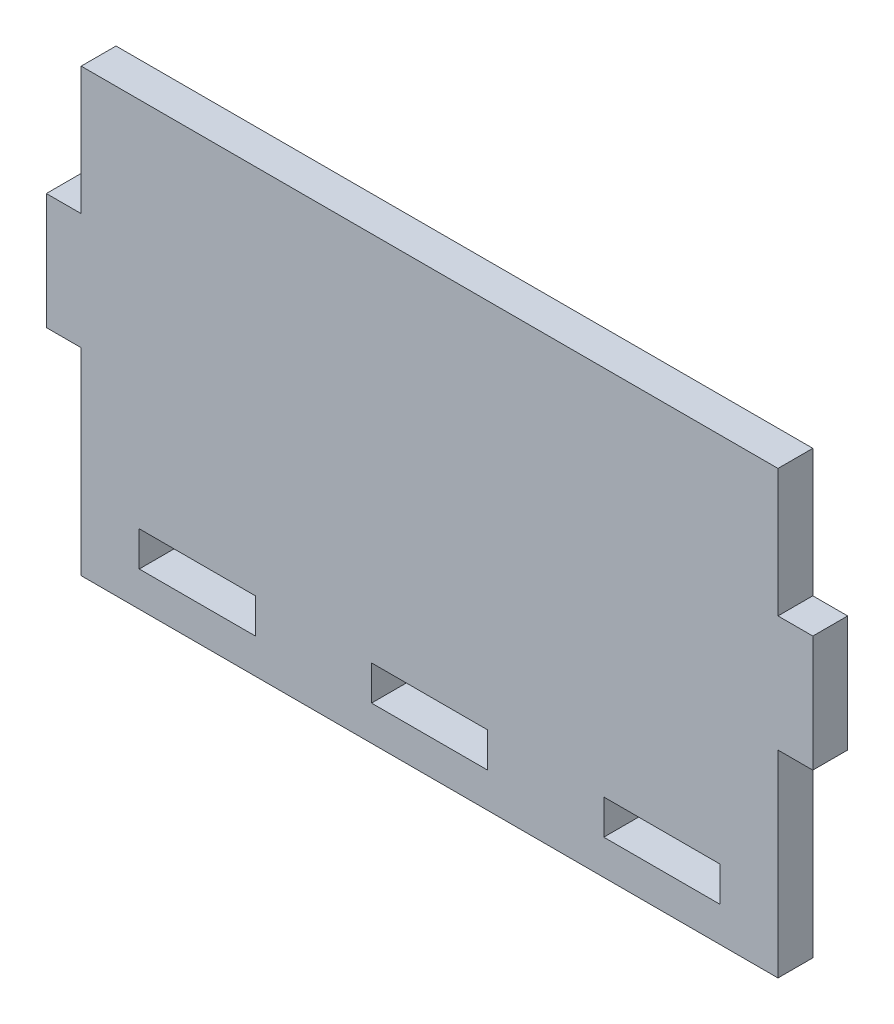
ISO-10303-21;
HEADER;
FILE_DESCRIPTION(('STEP AP214'),'2;1');
FILE_NAME('part.step','',(''),(''),'','','');
FILE_SCHEMA(('AUTOMOTIVE_DESIGN { 1 0 10303 214 1 1 1 1 }'));
ENDSEC;
DATA;
#1=APPLICATION_CONTEXT('core data for automotive mechanical design processes');
#2=APPLICATION_PROTOCOL_DEFINITION('international standard','automotive_design',2000,#1);
#3=PRODUCT_CONTEXT('',#1,'mechanical');
#4=PRODUCT('Part','Part','',(#3));
#5=PRODUCT_RELATED_PRODUCT_CATEGORY('part','',(#4));
#6=PRODUCT_DEFINITION_FORMATION('','',#4);
#7=PRODUCT_DEFINITION_CONTEXT('part definition',#1,'design');
#8=PRODUCT_DEFINITION('design','',#6,#7);
#9=PRODUCT_DEFINITION_SHAPE('','',#8);
#10=(LENGTH_UNIT() NAMED_UNIT(*) SI_UNIT(.MILLI.,.METRE.));
#11=(NAMED_UNIT(*) PLANE_ANGLE_UNIT() SI_UNIT($,.RADIAN.));
#12=(NAMED_UNIT(*) SI_UNIT($,.STERADIAN.) SOLID_ANGLE_UNIT());
#13=UNCERTAINTY_MEASURE_WITH_UNIT(LENGTH_MEASURE(1.E-05),#10,'distance_accuracy_value','');
#14=(GEOMETRIC_REPRESENTATION_CONTEXT(3) GLOBAL_UNCERTAINTY_ASSIGNED_CONTEXT((#13)) GLOBAL_UNIT_ASSIGNED_CONTEXT((#10,
#11,#12)) REPRESENTATION_CONTEXT('',''));
#15=CARTESIAN_POINT('',(0.,0.,0.));
#16=DIRECTION('',(0.,0.,1.));
#17=DIRECTION('',(1.,0.,0.));
#18=AXIS2_PLACEMENT_3D('',#15,#16,#17);
#19=CARTESIAN_POINT('',(12.1493212669683,0.,3.));
#20=DIRECTION('',(1.,0.,0.));
#21=DIRECTION('',(0.,0.,-1.));
#22=AXIS2_PLACEMENT_3D('',#19,#20,#21);
#23=PLANE('',#22);
#24=DIRECTION('',(0.,-1.,0.));
#25=VECTOR('',#24,1.);
#26=CARTESIAN_POINT('',(12.1493212669683,0.,0.));
#27=LINE('',#26,#25);
#28=CARTESIAN_POINT('',(12.1493212669683,-16.9321266968326,0.));
#29=VERTEX_POINT('',#28);
#30=CARTESIAN_POINT('',(12.1493212669683,-19.9321266968326,0.));
#31=VERTEX_POINT('',#30);
#32=EDGE_CURVE('E284',#29,#31,#27,.T.);
#33=ORIENTED_EDGE('',*,*,#32,.F.);
#34=DIRECTION('',(0.,0.,-1.));
#35=VECTOR('',#34,1.);
#36=CARTESIAN_POINT('',(12.1493212669683,-16.9321266968326,3.));
#37=LINE('',#36,#35);
#38=CARTESIAN_POINT('',(12.1493212669683,-16.9321266968326,3.));
#39=VERTEX_POINT('',#38);
#40=EDGE_CURVE('E11',#39,#29,#37,.T.);
#41=ORIENTED_EDGE('',*,*,#40,.F.);
#42=DIRECTION('',(0.,-1.,0.));
#43=VECTOR('',#42,1.);
#44=CARTESIAN_POINT('',(12.1493212669683,0.,3.));
#45=LINE('',#44,#43);
#46=CARTESIAN_POINT('',(12.1493212669683,-19.9321266968326,3.));
#47=VERTEX_POINT('',#46);
#48=EDGE_CURVE('E221',#39,#47,#45,.T.);
#49=ORIENTED_EDGE('',*,*,#48,.T.);
#50=DIRECTION('',(0.,0.,-1.));
#51=VECTOR('',#50,1.);
#52=CARTESIAN_POINT('',(12.1493212669683,-19.9321266968326,3.));
#53=LINE('',#52,#51);
#54=EDGE_CURVE('E134',#47,#31,#53,.T.);
#55=ORIENTED_EDGE('',*,*,#54,.T.);
#56=EDGE_LOOP('',(#33,#41,#49,#55));
#57=FACE_BOUND('',#56,.T.);
#58=ADVANCED_FACE('F32',(#57),#23,.T.);
#59=CARTESIAN_POINT('',(0.,-16.9321266968326,3.));
#60=DIRECTION('',(0.,-1.,0.));
#61=DIRECTION('',(0.,0.,-1.));
#62=AXIS2_PLACEMENT_3D('',#59,#60,#61);
#63=PLANE('',#62);
#64=DIRECTION('',(-1.,0.,0.));
#65=VECTOR('',#64,1.);
#66=CARTESIAN_POINT('',(0.,-16.9321266968326,0.));
#67=LINE('',#66,#65);
#68=CARTESIAN_POINT('',(22.1493212669683,-16.9321266968326,0.));
#69=VERTEX_POINT('',#68);
#70=EDGE_CURVE('E211',#69,#29,#67,.T.);
#71=ORIENTED_EDGE('',*,*,#70,.F.);
#72=DIRECTION('',(0.,0.,-1.));
#73=VECTOR('',#72,1.);
#74=CARTESIAN_POINT('',(22.1493212669683,-16.9321266968326,3.));
#75=LINE('',#74,#73);
#76=CARTESIAN_POINT('',(22.1493212669683,-16.9321266968326,3.));
#77=VERTEX_POINT('',#76);
#78=EDGE_CURVE('E42',#77,#69,#75,.T.);
#79=ORIENTED_EDGE('',*,*,#78,.F.);
#80=DIRECTION('',(-1.,0.,0.));
#81=VECTOR('',#80,1.);
#82=CARTESIAN_POINT('',(0.,-16.9321266968326,3.));
#83=LINE('',#82,#81);
#84=EDGE_CURVE('E209',#77,#39,#83,.T.);
#85=ORIENTED_EDGE('',*,*,#84,.T.);
#86=ORIENTED_EDGE('',*,*,#40,.T.);
#87=EDGE_LOOP('',(#71,#79,#85,#86));
#88=FACE_BOUND('',#87,.T.);
#89=ADVANCED_FACE('F207',(#88),#63,.T.);
#90=CARTESIAN_POINT('',(22.1493212669683,0.,3.));
#91=DIRECTION('',(1.,0.,0.));
#92=DIRECTION('',(0.,1.,0.));
#93=AXIS2_PLACEMENT_3D('',#90,#91,#92);
#94=PLANE('',#93);
#95=DIRECTION('',(0.,-1.,0.));
#96=VECTOR('',#95,1.);
#97=CARTESIAN_POINT('',(22.1493212669683,0.,0.));
#98=LINE('',#97,#96);
#99=CARTESIAN_POINT('',(22.1493212669683,-19.9321266968326,0.));
#100=VERTEX_POINT('',#99);
#101=EDGE_CURVE('E287',#69,#100,#98,.T.);
#102=ORIENTED_EDGE('',*,*,#101,.T.);
#103=DIRECTION('',(0.,0.,-1.));
#104=VECTOR('',#103,1.);
#105=CARTESIAN_POINT('',(22.1493212669683,-19.9321266968326,3.));
#106=LINE('',#105,#104);
#107=CARTESIAN_POINT('',(22.1493212669683,-19.9321266968326,3.));
#108=VERTEX_POINT('',#107);
#109=EDGE_CURVE('E214',#108,#100,#106,.T.);
#110=ORIENTED_EDGE('',*,*,#109,.F.);
#111=DIRECTION('',(0.,-1.,0.));
#112=VECTOR('',#111,1.);
#113=CARTESIAN_POINT('',(22.1493212669683,0.,3.));
#114=LINE('',#113,#112);
#115=EDGE_CURVE('E217',#77,#108,#114,.T.);
#116=ORIENTED_EDGE('',*,*,#115,.F.);
#117=ORIENTED_EDGE('',*,*,#78,.T.);
#118=EDGE_LOOP('',(#102,#110,#116,#117));
#119=FACE_BOUND('',#118,.T.);
#120=ADVANCED_FACE('F218',(#119),#94,.F.);
#121=CARTESIAN_POINT('',(-27.8506787330317,0.,3.));
#122=DIRECTION('',(1.,0.,0.));
#123=DIRECTION('',(0.,1.,0.));
#124=AXIS2_PLACEMENT_3D('',#121,#122,#123);
#125=PLANE('',#124);
#126=DIRECTION('',(0.,-1.,0.));
#127=VECTOR('',#126,1.);
#128=CARTESIAN_POINT('',(-27.8506787330317,0.,0.));
#129=LINE('',#128,#127);
#130=CARTESIAN_POINT('',(-27.8506787330317,-16.9321266968326,0.));
#131=VERTEX_POINT('',#130);
#132=CARTESIAN_POINT('',(-27.8506787330317,-19.9321266968326,0.));
#133=VERTEX_POINT('',#132);
#134=EDGE_CURVE('E272',#131,#133,#129,.T.);
#135=ORIENTED_EDGE('',*,*,#134,.F.);
#136=DIRECTION('',(0.,0.,-1.));
#137=VECTOR('',#136,1.);
#138=CARTESIAN_POINT('',(-27.8506787330317,-16.9321266968326,3.));
#139=LINE('',#138,#137);
#140=CARTESIAN_POINT('',(-27.8506787330317,-16.9321266968326,3.));
#141=VERTEX_POINT('',#140);
#142=EDGE_CURVE('E292',#141,#131,#139,.T.);
#143=ORIENTED_EDGE('',*,*,#142,.F.);
#144=DIRECTION('',(0.,-1.,0.));
#145=VECTOR('',#144,1.);
#146=CARTESIAN_POINT('',(-27.8506787330317,0.,3.));
#147=LINE('',#146,#145);
#148=CARTESIAN_POINT('',(-27.8506787330317,-19.9321266968326,3.));
#149=VERTEX_POINT('',#148);
#150=EDGE_CURVE('E669',#141,#149,#147,.T.);
#151=ORIENTED_EDGE('',*,*,#150,.T.);
#152=DIRECTION('',(0.,0.,-1.));
#153=VECTOR('',#152,1.);
#154=CARTESIAN_POINT('',(-27.8506787330317,-19.9321266968326,3.));
#155=LINE('',#154,#153);
#156=EDGE_CURVE('E294',#149,#133,#155,.T.);
#157=ORIENTED_EDGE('',*,*,#156,.T.);
#158=EDGE_LOOP('',(#135,#143,#151,#157));
#159=FACE_BOUND('',#158,.T.);
#160=ADVANCED_FACE('F381',(#159),#125,.T.);
#161=CARTESIAN_POINT('',(0.,-16.9321266968326,3.));
#162=DIRECTION('',(0.,1.,0.));
#163=DIRECTION('',(0.,0.,1.));
#164=AXIS2_PLACEMENT_3D('',#161,#162,#163);
#165=PLANE('',#164);
#166=DIRECTION('',(1.,0.,0.));
#167=VECTOR('',#166,1.);
#168=CARTESIAN_POINT('',(0.,-16.9321266968326,0.));
#169=LINE('',#168,#167);
#170=CARTESIAN_POINT('',(-17.8506787330317,-16.9321266968326,0.));
#171=VERTEX_POINT('',#170);
#172=EDGE_CURVE('E275',#131,#171,#169,.T.);
#173=ORIENTED_EDGE('',*,*,#172,.T.);
#174=DIRECTION('',(0.,0.,-1.));
#175=VECTOR('',#174,1.);
#176=CARTESIAN_POINT('',(-17.8506787330317,-16.9321266968326,3.));
#177=LINE('',#176,#175);
#178=CARTESIAN_POINT('',(-17.8506787330317,-16.9321266968326,3.));
#179=VERTEX_POINT('',#178);
#180=EDGE_CURVE('E299',#179,#171,#177,.T.);
#181=ORIENTED_EDGE('',*,*,#180,.F.);
#182=DIRECTION('',(1.,0.,0.));
#183=VECTOR('',#182,1.);
#184=CARTESIAN_POINT('',(0.,-16.9321266968326,3.));
#185=LINE('',#184,#183);
#186=EDGE_CURVE('E672',#141,#179,#185,.T.);
#187=ORIENTED_EDGE('',*,*,#186,.F.);
#188=ORIENTED_EDGE('',*,*,#142,.T.);
#189=EDGE_LOOP('',(#173,#181,#187,#188));
#190=FACE_BOUND('',#189,.T.);
#191=ADVANCED_FACE('F377',(#190),#165,.F.);
#192=CARTESIAN_POINT('',(-17.8506787330317,0.,3.));
#193=DIRECTION('',(1.,0.,0.));
#194=DIRECTION('',(0.,0.,-1.));
#195=AXIS2_PLACEMENT_3D('',#192,#193,#194);
#196=PLANE('',#195);
#197=DIRECTION('',(0.,-1.,0.));
#198=VECTOR('',#197,1.);
#199=CARTESIAN_POINT('',(-17.8506787330317,0.,0.));
#200=LINE('',#199,#198);
#201=CARTESIAN_POINT('',(-17.8506787330317,-19.9321266968326,0.));
#202=VERTEX_POINT('',#201);
#203=EDGE_CURVE('E278',#171,#202,#200,.T.);
#204=ORIENTED_EDGE('',*,*,#203,.T.);
#205=DIRECTION('',(0.,0.,-1.));
#206=VECTOR('',#205,1.);
#207=CARTESIAN_POINT('',(-17.8506787330317,-19.9321266968326,3.));
#208=LINE('',#207,#206);
#209=CARTESIAN_POINT('',(-17.8506787330317,-19.9321266968326,3.));
#210=VERTEX_POINT('',#209);
#211=EDGE_CURVE('E296',#210,#202,#208,.T.);
#212=ORIENTED_EDGE('',*,*,#211,.F.);
#213=DIRECTION('',(0.,-1.,0.));
#214=VECTOR('',#213,1.);
#215=CARTESIAN_POINT('',(-17.8506787330317,0.,3.));
#216=LINE('',#215,#214);
#217=EDGE_CURVE('E675',#179,#210,#216,.T.);
#218=ORIENTED_EDGE('',*,*,#217,.F.);
#219=ORIENTED_EDGE('',*,*,#180,.T.);
#220=EDGE_LOOP('',(#204,#212,#218,#219));
#221=FACE_BOUND('',#220,.T.);
#222=ADVANCED_FACE('F373',(#221),#196,.F.);
#223=CARTESIAN_POINT('',(27.1493212669683,0.,3.));
#224=DIRECTION('',(1.,0.,0.));
#225=DIRECTION('',(0.,0.,-1.));
#226=AXIS2_PLACEMENT_3D('',#223,#224,#225);
#227=PLANE('',#226);
#228=DIRECTION('',(0.,-1.,0.));
#229=VECTOR('',#228,1.);
#230=CARTESIAN_POINT('',(27.1493212669683,0.,0.));
#231=LINE('',#230,#229);
#232=CARTESIAN_POINT('',(27.1493212669683,15.0678733031674,0.));
#233=VERTEX_POINT('',#232);
#234=CARTESIAN_POINT('',(27.1493212669683,4.06787330316742,0.));
#235=VERTEX_POINT('',#234);
#236=EDGE_CURVE('E240',#233,#235,#231,.T.);
#237=ORIENTED_EDGE('',*,*,#236,.F.);
#238=DIRECTION('',(0.,0.,-1.));
#239=VECTOR('',#238,1.);
#240=CARTESIAN_POINT('',(27.1493212669683,15.0678733031674,3.));
#241=LINE('',#240,#239);
#242=CARTESIAN_POINT('',(27.1493212669683,15.0678733031674,3.));
#243=VERTEX_POINT('',#242);
#244=EDGE_CURVE('E297',#243,#233,#241,.T.);
#245=ORIENTED_EDGE('',*,*,#244,.F.);
#246=DIRECTION('',(0.,-1.,0.));
#247=VECTOR('',#246,1.);
#248=CARTESIAN_POINT('',(27.1493212669683,0.,3.));
#249=LINE('',#248,#247);
#250=CARTESIAN_POINT('',(27.1493212669683,4.06787330316742,3.));
#251=VERTEX_POINT('',#250);
#252=EDGE_CURVE('E658',#243,#251,#249,.T.);
#253=ORIENTED_EDGE('',*,*,#252,.T.);
#254=DIRECTION('',(0.,0.,-1.));
#255=VECTOR('',#254,1.);
#256=CARTESIAN_POINT('',(27.1493212669683,4.06787330316742,3.));
#257=LINE('',#256,#255);
#258=EDGE_CURVE('E303',#251,#235,#257,.T.);
#259=ORIENTED_EDGE('',*,*,#258,.T.);
#260=EDGE_LOOP('',(#237,#245,#253,#259));
#261=FACE_BOUND('',#260,.T.);
#262=ADVANCED_FACE('F376',(#261),#227,.T.);
#263=CARTESIAN_POINT('',(0.,15.0678733031674,3.));
#264=DIRECTION('',(0.,1.,0.));
#265=DIRECTION('',(0.,0.,1.));
#266=AXIS2_PLACEMENT_3D('',#263,#264,#265);
#267=PLANE('',#266);
#268=DIRECTION('',(1.,0.,0.));
#269=VECTOR('',#268,1.);
#270=CARTESIAN_POINT('',(0.,15.0678733031674,0.));
#271=LINE('',#270,#269);
#272=CARTESIAN_POINT('',(-32.8506787330317,15.0678733031674,0.));
#273=VERTEX_POINT('',#272);
#274=EDGE_CURVE('E243',#273,#233,#271,.T.);
#275=ORIENTED_EDGE('',*,*,#274,.F.);
#276=DIRECTION('',(0.,0.,-1.));
#277=VECTOR('',#276,1.);
#278=CARTESIAN_POINT('',(-32.8506787330317,15.0678733031674,3.));
#279=LINE('',#278,#277);
#280=CARTESIAN_POINT('',(-32.8506787330317,15.0678733031674,3.));
#281=VERTEX_POINT('',#280);
#282=EDGE_CURVE('E328',#281,#273,#279,.T.);
#283=ORIENTED_EDGE('',*,*,#282,.F.);
#284=DIRECTION('',(1.,0.,0.));
#285=VECTOR('',#284,1.);
#286=CARTESIAN_POINT('',(0.,15.0678733031674,3.));
#287=LINE('',#286,#285);
#288=EDGE_CURVE('E619',#281,#243,#287,.T.);
#289=ORIENTED_EDGE('',*,*,#288,.T.);
#290=ORIENTED_EDGE('',*,*,#244,.T.);
#291=EDGE_LOOP('',(#275,#283,#289,#290));
#292=FACE_BOUND('',#291,.T.);
#293=ADVANCED_FACE('F422',(#292),#267,.T.);
#294=CARTESIAN_POINT('',(-32.8506787330317,0.,3.));
#295=DIRECTION('',(1.,0.,0.));
#296=DIRECTION('',(0.,1.,0.));
#297=AXIS2_PLACEMENT_3D('',#294,#295,#296);
#298=PLANE('',#297);
#299=DIRECTION('',(0.,-1.,0.));
#300=VECTOR('',#299,1.);
#301=CARTESIAN_POINT('',(-32.8506787330317,0.,0.));
#302=LINE('',#301,#300);
#303=CARTESIAN_POINT('',(-32.8506787330317,4.06787330316742,0.));
#304=VERTEX_POINT('',#303);
#305=EDGE_CURVE('E247',#273,#304,#302,.T.);
#306=ORIENTED_EDGE('',*,*,#305,.T.);
#307=DIRECTION('',(0.,0.,-1.));
#308=VECTOR('',#307,1.);
#309=CARTESIAN_POINT('',(-32.8506787330317,4.06787330316742,3.));
#310=LINE('',#309,#308);
#311=CARTESIAN_POINT('',(-32.8506787330317,4.06787330316742,3.));
#312=VERTEX_POINT('',#311);
#313=EDGE_CURVE('E325',#312,#304,#310,.T.);
#314=ORIENTED_EDGE('',*,*,#313,.F.);
#315=DIRECTION('',(0.,-1.,0.));
#316=VECTOR('',#315,1.);
#317=CARTESIAN_POINT('',(-32.8506787330317,0.,3.));
#318=LINE('',#317,#316);
#319=EDGE_CURVE('E654',#281,#312,#318,.T.);
#320=ORIENTED_EDGE('',*,*,#319,.F.);
#321=ORIENTED_EDGE('',*,*,#282,.T.);
#322=EDGE_LOOP('',(#306,#314,#320,#321));
#323=FACE_BOUND('',#322,.T.);
#324=ADVANCED_FACE('F410',(#323),#298,.F.);
#325=CARTESIAN_POINT('',(0.,4.06787330316742,3.));
#326=DIRECTION('',(0.,-1.,0.));
#327=DIRECTION('',(0.,0.,-1.));
#328=AXIS2_PLACEMENT_3D('',#325,#326,#327);
#329=PLANE('',#328);
#330=DIRECTION('',(-1.,0.,0.));
#331=VECTOR('',#330,1.);
#332=CARTESIAN_POINT('',(0.,4.06787330316742,0.));
#333=LINE('',#332,#331);
#334=CARTESIAN_POINT('',(-35.8506787330317,4.06787330316742,0.));
#335=VERTEX_POINT('',#334);
#336=EDGE_CURVE('E250',#304,#335,#333,.T.);
#337=ORIENTED_EDGE('',*,*,#336,.T.);
#338=DIRECTION('',(0.,0.,-1.));
#339=VECTOR('',#338,1.);
#340=CARTESIAN_POINT('',(-35.8506787330317,4.06787330316742,3.));
#341=LINE('',#340,#339);
#342=CARTESIAN_POINT('',(-35.8506787330317,4.06787330316742,3.));
#343=VERTEX_POINT('',#342);
#344=EDGE_CURVE('E322',#343,#335,#341,.T.);
#345=ORIENTED_EDGE('',*,*,#344,.F.);
#346=DIRECTION('',(-1.,0.,0.));
#347=VECTOR('',#346,1.);
#348=CARTESIAN_POINT('',(0.,4.06787330316742,3.));
#349=LINE('',#348,#347);
#350=EDGE_CURVE('E651',#312,#343,#349,.T.);
#351=ORIENTED_EDGE('',*,*,#350,.F.);
#352=ORIENTED_EDGE('',*,*,#313,.T.);
#353=EDGE_LOOP('',(#337,#345,#351,#352));
#354=FACE_BOUND('',#353,.T.);
#355=ADVANCED_FACE('F417',(#354),#329,.F.);
#356=CARTESIAN_POINT('',(-35.8506787330317,0.,3.));
#357=DIRECTION('',(1.,0.,0.));
#358=DIRECTION('',(0.,0.,-1.));
#359=AXIS2_PLACEMENT_3D('',#356,#357,#358);
#360=PLANE('',#359);
#361=DIRECTION('',(0.,-1.,0.));
#362=VECTOR('',#361,1.);
#363=CARTESIAN_POINT('',(-35.8506787330317,0.,0.));
#364=LINE('',#363,#362);
#365=CARTESIAN_POINT('',(-35.8506787330317,-5.93212669683258,0.));
#366=VERTEX_POINT('',#365);
#367=EDGE_CURVE('E254',#335,#366,#364,.T.);
#368=ORIENTED_EDGE('',*,*,#367,.T.);
#369=DIRECTION('',(0.,0.,-1.));
#370=VECTOR('',#369,1.);
#371=CARTESIAN_POINT('',(-35.8506787330317,-5.93212669683258,3.));
#372=LINE('',#371,#370);
#373=CARTESIAN_POINT('',(-35.8506787330317,-5.93212669683258,3.));
#374=VERTEX_POINT('',#373);
#375=EDGE_CURVE('E319',#374,#366,#372,.T.);
#376=ORIENTED_EDGE('',*,*,#375,.F.);
#377=DIRECTION('',(0.,-1.,0.));
#378=VECTOR('',#377,1.);
#379=CARTESIAN_POINT('',(-35.8506787330317,0.,3.));
#380=LINE('',#379,#378);
#381=EDGE_CURVE('E649',#343,#374,#380,.T.);
#382=ORIENTED_EDGE('',*,*,#381,.F.);
#383=ORIENTED_EDGE('',*,*,#344,.T.);
#384=EDGE_LOOP('',(#368,#376,#382,#383));
#385=FACE_BOUND('',#384,.T.);
#386=ADVANCED_FACE('F413',(#385),#360,.F.);
#387=CARTESIAN_POINT('',(0.,-5.93212669683258,3.));
#388=DIRECTION('',(0.,1.,0.));
#389=DIRECTION('',(0.,0.,1.));
#390=AXIS2_PLACEMENT_3D('',#387,#388,#389);
#391=PLANE('',#390);
#392=DIRECTION('',(1.,0.,0.));
#393=VECTOR('',#392,1.);
#394=CARTESIAN_POINT('',(0.,-5.93212669683258,0.));
#395=LINE('',#394,#393);
#396=CARTESIAN_POINT('',(-32.8506787330317,-5.93212669683258,0.));
#397=VERTEX_POINT('',#396);
#398=EDGE_CURVE('E257',#366,#397,#395,.T.);
#399=ORIENTED_EDGE('',*,*,#398,.T.);
#400=DIRECTION('',(0.,0.,-1.));
#401=VECTOR('',#400,1.);
#402=CARTESIAN_POINT('',(-32.8506787330317,-5.93212669683258,3.));
#403=LINE('',#402,#401);
#404=CARTESIAN_POINT('',(-32.8506787330317,-5.93212669683258,3.));
#405=VERTEX_POINT('',#404);
#406=EDGE_CURVE('E316',#405,#397,#403,.T.);
#407=ORIENTED_EDGE('',*,*,#406,.F.);
#408=DIRECTION('',(1.,0.,0.));
#409=VECTOR('',#408,1.);
#410=CARTESIAN_POINT('',(0.,-5.93212669683258,3.));
#411=LINE('',#410,#409);
#412=EDGE_CURVE('E646',#374,#405,#411,.T.);
#413=ORIENTED_EDGE('',*,*,#412,.F.);
#414=ORIENTED_EDGE('',*,*,#375,.T.);
#415=EDGE_LOOP('',(#399,#407,#413,#414));
#416=FACE_BOUND('',#415,.T.);
#417=ADVANCED_FACE('F408',(#416),#391,.F.);
#418=CARTESIAN_POINT('',(-32.8506787330317,-22.9321266968326,0.));
#419=VERTEX_POINT('',#418);
#420=EDGE_CURVE('E251',#397,#419,#302,.T.);
#421=ORIENTED_EDGE('',*,*,#420,.T.);
#422=DIRECTION('',(0.,0.,-1.));
#423=VECTOR('',#422,1.);
#424=CARTESIAN_POINT('',(-32.8506787330317,-22.9321266968326,3.));
#425=LINE('',#424,#423);
#426=CARTESIAN_POINT('',(-32.8506787330317,-22.9321266968326,3.));
#427=VERTEX_POINT('',#426);
#428=EDGE_CURVE('E313',#427,#419,#425,.T.);
#429=ORIENTED_EDGE('',*,*,#428,.F.);
#430=EDGE_CURVE('E643',#405,#427,#318,.T.);
#431=ORIENTED_EDGE('',*,*,#430,.F.);
#432=ORIENTED_EDGE('',*,*,#406,.T.);
#433=EDGE_LOOP('',(#421,#429,#431,#432));
#434=FACE_BOUND('',#433,.T.);
#435=ADVANCED_FACE('F404',(#434),#298,.F.);
#436=CARTESIAN_POINT('',(0.,-22.9321266968326,3.));
#437=DIRECTION('',(0.,1.,0.));
#438=DIRECTION('',(0.,0.,1.));
#439=AXIS2_PLACEMENT_3D('',#436,#437,#438);
#440=PLANE('',#439);
#441=DIRECTION('',(1.,0.,0.));
#442=VECTOR('',#441,1.);
#443=CARTESIAN_POINT('',(0.,-22.9321266968326,0.));
#444=LINE('',#443,#442);
#445=CARTESIAN_POINT('',(27.1493212669683,-22.9321266968326,0.));
#446=VERTEX_POINT('',#445);
#447=EDGE_CURVE('E260',#419,#446,#444,.T.);
#448=ORIENTED_EDGE('',*,*,#447,.T.);
#449=DIRECTION('',(0.,0.,-1.));
#450=VECTOR('',#449,1.);
#451=CARTESIAN_POINT('',(27.1493212669683,-22.9321266968326,3.));
#452=LINE('',#451,#450);
#453=CARTESIAN_POINT('',(27.1493212669683,-22.9321266968326,3.));
#454=VERTEX_POINT('',#453);
#455=EDGE_CURVE('E311',#454,#446,#452,.T.);
#456=ORIENTED_EDGE('',*,*,#455,.F.);
#457=DIRECTION('',(1.,0.,0.));
#458=VECTOR('',#457,1.);
#459=CARTESIAN_POINT('',(0.,-22.9321266968326,3.));
#460=LINE('',#459,#458);
#461=EDGE_CURVE('E660',#427,#454,#460,.T.);
#462=ORIENTED_EDGE('',*,*,#461,.F.);
#463=ORIENTED_EDGE('',*,*,#428,.T.);
#464=EDGE_LOOP('',(#448,#456,#462,#463));
#465=FACE_BOUND('',#464,.T.);
#466=ADVANCED_FACE('F400',(#465),#440,.F.);
#467=CARTESIAN_POINT('',(27.1493212669683,-5.93212669683258,0.));
#468=VERTEX_POINT('',#467);
#469=EDGE_CURVE('E244',#468,#446,#231,.T.);
#470=ORIENTED_EDGE('',*,*,#469,.F.);
#471=DIRECTION('',(0.,0.,-1.));
#472=VECTOR('',#471,1.);
#473=CARTESIAN_POINT('',(27.1493212669683,-5.93212669683258,3.));
#474=LINE('',#473,#472);
#475=CARTESIAN_POINT('',(27.1493212669683,-5.93212669683258,3.));
#476=VERTEX_POINT('',#475);
#477=EDGE_CURVE('E309',#476,#468,#474,.T.);
#478=ORIENTED_EDGE('',*,*,#477,.F.);
#479=EDGE_CURVE('E638',#476,#454,#249,.T.);
#480=ORIENTED_EDGE('',*,*,#479,.T.);
#481=ORIENTED_EDGE('',*,*,#455,.T.);
#482=EDGE_LOOP('',(#470,#478,#480,#481));
#483=FACE_BOUND('',#482,.T.);
#484=ADVANCED_FACE('F396',(#483),#227,.T.);
#485=CARTESIAN_POINT('',(0.,-5.93212669683258,3.));
#486=DIRECTION('',(0.,-1.,0.));
#487=DIRECTION('',(0.,0.,-1.));
#488=AXIS2_PLACEMENT_3D('',#485,#486,#487);
#489=PLANE('',#488);
#490=DIRECTION('',(-1.,0.,0.));
#491=VECTOR('',#490,1.);
#492=CARTESIAN_POINT('',(0.,-5.93212669683258,0.));
#493=LINE('',#492,#491);
#494=CARTESIAN_POINT('',(30.1493212669683,-5.93212669683258,0.));
#495=VERTEX_POINT('',#494);
#496=EDGE_CURVE('E263',#495,#468,#493,.T.);
#497=ORIENTED_EDGE('',*,*,#496,.F.);
#498=DIRECTION('',(0.,0.,-1.));
#499=VECTOR('',#498,1.);
#500=CARTESIAN_POINT('',(30.1493212669683,-5.93212669683258,3.));
#501=LINE('',#500,#499);
#502=CARTESIAN_POINT('',(30.1493212669683,-5.93212669683258,3.));
#503=VERTEX_POINT('',#502);
#504=EDGE_CURVE('E307',#503,#495,#501,.T.);
#505=ORIENTED_EDGE('',*,*,#504,.F.);
#506=DIRECTION('',(-1.,0.,0.));
#507=VECTOR('',#506,1.);
#508=CARTESIAN_POINT('',(0.,-5.93212669683258,3.));
#509=LINE('',#508,#507);
#510=EDGE_CURVE('E634',#503,#476,#509,.T.);
#511=ORIENTED_EDGE('',*,*,#510,.T.);
#512=ORIENTED_EDGE('',*,*,#477,.T.);
#513=EDGE_LOOP('',(#497,#505,#511,#512));
#514=FACE_BOUND('',#513,.T.);
#515=ADVANCED_FACE('F392',(#514),#489,.T.);
#516=CARTESIAN_POINT('',(30.1493212669683,0.,3.));
#517=DIRECTION('',(1.,0.,0.));
#518=DIRECTION('',(0.,0.,-1.));
#519=AXIS2_PLACEMENT_3D('',#516,#517,#518);
#520=PLANE('',#519);
#521=DIRECTION('',(0.,-1.,0.));
#522=VECTOR('',#521,1.);
#523=CARTESIAN_POINT('',(30.1493212669683,0.,0.));
#524=LINE('',#523,#522);
#525=CARTESIAN_POINT('',(30.1493212669683,4.06787330316742,0.));
#526=VERTEX_POINT('',#525);
#527=EDGE_CURVE('E266',#526,#495,#524,.T.);
#528=ORIENTED_EDGE('',*,*,#527,.F.);
#529=DIRECTION('',(0.,0.,-1.));
#530=VECTOR('',#529,1.);
#531=CARTESIAN_POINT('',(30.1493212669683,4.06787330316742,3.));
#532=LINE('',#531,#530);
#533=CARTESIAN_POINT('',(30.1493212669683,4.06787330316742,3.));
#534=VERTEX_POINT('',#533);
#535=EDGE_CURVE('E305',#534,#526,#532,.T.);
#536=ORIENTED_EDGE('',*,*,#535,.F.);
#537=DIRECTION('',(0.,-1.,0.));
#538=VECTOR('',#537,1.);
#539=CARTESIAN_POINT('',(30.1493212669683,0.,3.));
#540=LINE('',#539,#538);
#541=EDGE_CURVE('E666',#534,#503,#540,.T.);
#542=ORIENTED_EDGE('',*,*,#541,.T.);
#543=ORIENTED_EDGE('',*,*,#504,.T.);
#544=EDGE_LOOP('',(#528,#536,#542,#543));
#545=FACE_BOUND('',#544,.T.);
#546=ADVANCED_FACE('F389',(#545),#520,.T.);
#547=CARTESIAN_POINT('',(0.,-16.9321266968326,3.));
#548=DIRECTION('',(0.,1.,0.));
#549=DIRECTION('',(0.,0.,1.));
#550=AXIS2_PLACEMENT_3D('',#547,#548,#549);
#551=PLANE('',#550);
#552=DIRECTION('',(1.,0.,0.));
#553=VECTOR('',#552,1.);
#554=CARTESIAN_POINT('',(0.,-16.9321266968326,0.));
#555=LINE('',#554,#553);
#556=CARTESIAN_POINT('',(-7.85067873303169,-16.9321266968326,0.));
#557=VERTEX_POINT('',#556);
#558=CARTESIAN_POINT('',(2.14932126696831,-16.9321266968326,0.));
#559=VERTEX_POINT('',#558);
#560=EDGE_CURVE('E229',#557,#559,#555,.T.);
#561=ORIENTED_EDGE('',*,*,#560,.T.);
#562=DIRECTION('',(0.,0.,-1.));
#563=VECTOR('',#562,1.);
#564=CARTESIAN_POINT('',(2.14932126696831,-16.9321266968326,3.));
#565=LINE('',#564,#563);
#566=CARTESIAN_POINT('',(2.14932126696831,-16.9321266968326,3.));
#567=VERTEX_POINT('',#566);
#568=EDGE_CURVE('E36',#567,#559,#565,.T.);
#569=ORIENTED_EDGE('',*,*,#568,.F.);
#570=DIRECTION('',(1.,0.,0.));
#571=VECTOR('',#570,1.);
#572=CARTESIAN_POINT('',(0.,-16.9321266968326,3.));
#573=LINE('',#572,#571);
#574=CARTESIAN_POINT('',(-7.85067873303169,-16.9321266968326,3.));
#575=VERTEX_POINT('',#574);
#576=EDGE_CURVE('E290',#575,#567,#573,.T.);
#577=ORIENTED_EDGE('',*,*,#576,.F.);
#578=DIRECTION('',(0.,0.,-1.));
#579=VECTOR('',#578,1.);
#580=CARTESIAN_POINT('',(-7.85067873303169,-16.9321266968326,3.));
#581=LINE('',#580,#579);
#582=EDGE_CURVE('E228',#575,#557,#581,.T.);
#583=ORIENTED_EDGE('',*,*,#582,.T.);
#584=EDGE_LOOP('',(#561,#569,#577,#583));
#585=FACE_BOUND('',#584,.T.);
#586=ADVANCED_FACE('F34',(#585),#551,.F.);
#587=CARTESIAN_POINT('',(2.1493212669683,0.,3.));
#588=DIRECTION('',(1.,0.,0.));
#589=DIRECTION('',(0.,1.,0.));
#590=AXIS2_PLACEMENT_3D('',#587,#588,#589);
#591=PLANE('',#590);
#592=DIRECTION('',(0.,-1.,0.));
#593=VECTOR('',#592,1.);
#594=CARTESIAN_POINT('',(2.1493212669683,0.,0.));
#595=LINE('',#594,#593);
#596=CARTESIAN_POINT('',(2.14932126696831,-19.9321266968326,0.));
#597=VERTEX_POINT('',#596);
#598=EDGE_CURVE('E232',#559,#597,#595,.T.);
#599=ORIENTED_EDGE('',*,*,#598,.T.);
#600=DIRECTION('',(0.,0.,-1.));
#601=VECTOR('',#600,1.);
#602=CARTESIAN_POINT('',(2.14932126696831,-19.9321266968326,3.));
#603=LINE('',#602,#601);
#604=CARTESIAN_POINT('',(2.14932126696831,-19.9321266968326,3.));
#605=VERTEX_POINT('',#604);
#606=EDGE_CURVE('E333',#605,#597,#603,.T.);
#607=ORIENTED_EDGE('',*,*,#606,.F.);
#608=DIRECTION('',(0.,-1.,0.));
#609=VECTOR('',#608,1.);
#610=CARTESIAN_POINT('',(2.1493212669683,0.,3.));
#611=LINE('',#610,#609);
#612=EDGE_CURVE('E142',#567,#605,#611,.T.);
#613=ORIENTED_EDGE('',*,*,#612,.F.);
#614=ORIENTED_EDGE('',*,*,#568,.T.);
#615=EDGE_LOOP('',(#599,#607,#613,#614));
#616=FACE_BOUND('',#615,.T.);
#617=ADVANCED_FACE('F339',(#616),#591,.F.);
#618=CARTESIAN_POINT('',(0.,-19.9321266968326,3.));
#619=DIRECTION('',(0.,-1.,0.));
#620=DIRECTION('',(0.,0.,-1.));
#621=AXIS2_PLACEMENT_3D('',#618,#619,#620);
#622=PLANE('',#621);
#623=DIRECTION('',(-1.,0.,0.));
#624=VECTOR('',#623,1.);
#625=CARTESIAN_POINT('',(0.,-19.9321266968326,0.));
#626=LINE('',#625,#624);
#627=CARTESIAN_POINT('',(-7.85067873303169,-19.9321266968326,0.));
#628=VERTEX_POINT('',#627);
#629=EDGE_CURVE('E234',#597,#628,#626,.T.);
#630=ORIENTED_EDGE('',*,*,#629,.T.);
#631=DIRECTION('',(0.,0.,-1.));
#632=VECTOR('',#631,1.);
#633=CARTESIAN_POINT('',(-7.85067873303169,-19.9321266968326,3.));
#634=LINE('',#633,#632);
#635=CARTESIAN_POINT('',(-7.85067873303169,-19.9321266968326,3.));
#636=VERTEX_POINT('',#635);
#637=EDGE_CURVE('E332',#636,#628,#634,.T.);
#638=ORIENTED_EDGE('',*,*,#637,.F.);
#639=DIRECTION('',(-1.,0.,0.));
#640=VECTOR('',#639,1.);
#641=CARTESIAN_POINT('',(0.,-19.9321266968326,3.));
#642=LINE('',#641,#640);
#643=EDGE_CURVE('E687',#605,#636,#642,.T.);
#644=ORIENTED_EDGE('',*,*,#643,.F.);
#645=ORIENTED_EDGE('',*,*,#606,.T.);
#646=EDGE_LOOP('',(#630,#638,#644,#645));
#647=FACE_BOUND('',#646,.T.);
#648=ADVANCED_FACE('F353',(#647),#622,.F.);
#649=CARTESIAN_POINT('',(0.,-19.9321266968326,3.));
#650=DIRECTION('',(0.,1.,0.));
#651=DIRECTION('',(0.,0.,1.));
#652=AXIS2_PLACEMENT_3D('',#649,#650,#651);
#653=PLANE('',#652);
#654=DIRECTION('',(1.,0.,0.));
#655=VECTOR('',#654,1.);
#656=CARTESIAN_POINT('',(0.,-19.9321266968326,0.));
#657=LINE('',#656,#655);
#658=EDGE_CURVE('E281',#133,#202,#657,.T.);
#659=ORIENTED_EDGE('',*,*,#658,.F.);
#660=ORIENTED_EDGE('',*,*,#156,.F.);
#661=DIRECTION('',(1.,0.,0.));
#662=VECTOR('',#661,1.);
#663=CARTESIAN_POINT('',(0.,-19.9321266968326,3.));
#664=LINE('',#663,#662);
#665=EDGE_CURVE('E223',#149,#210,#664,.T.);
#666=ORIENTED_EDGE('',*,*,#665,.T.);
#667=ORIENTED_EDGE('',*,*,#211,.T.);
#668=EDGE_LOOP('',(#659,#660,#666,#667));
#669=FACE_BOUND('',#668,.T.);
#670=ADVANCED_FACE('F355',(#669),#653,.T.);
#671=CARTESIAN_POINT('',(0.,4.06787330316742,3.));
#672=DIRECTION('',(0.,1.,0.));
#673=DIRECTION('',(0.,0.,1.));
#674=AXIS2_PLACEMENT_3D('',#671,#672,#673);
#675=PLANE('',#674);
#676=DIRECTION('',(1.,0.,0.));
#677=VECTOR('',#676,1.);
#678=CARTESIAN_POINT('',(0.,4.06787330316742,0.));
#679=LINE('',#678,#677);
#680=EDGE_CURVE('E269',#235,#526,#679,.T.);
#681=ORIENTED_EDGE('',*,*,#680,.F.);
#682=ORIENTED_EDGE('',*,*,#258,.F.);
#683=DIRECTION('',(1.,0.,0.));
#684=VECTOR('',#683,1.);
#685=CARTESIAN_POINT('',(0.,4.06787330316742,3.));
#686=LINE('',#685,#684);
#687=EDGE_CURVE('E626',#251,#534,#686,.T.);
#688=ORIENTED_EDGE('',*,*,#687,.T.);
#689=ORIENTED_EDGE('',*,*,#535,.T.);
#690=EDGE_LOOP('',(#681,#682,#688,#689));
#691=FACE_BOUND('',#690,.T.);
#692=ADVANCED_FACE('F361',(#691),#675,.T.);
#693=CARTESIAN_POINT('',(-7.85067873303169,0.,3.));
#694=DIRECTION('',(1.,0.,0.));
#695=DIRECTION('',(0.,0.,-1.));
#696=AXIS2_PLACEMENT_3D('',#693,#694,#695);
#697=PLANE('',#696);
#698=DIRECTION('',(0.,-1.,0.));
#699=VECTOR('',#698,1.);
#700=CARTESIAN_POINT('',(-7.85067873303169,0.,0.));
#701=LINE('',#700,#699);
#702=EDGE_CURVE('E237',#557,#628,#701,.T.);
#703=ORIENTED_EDGE('',*,*,#702,.F.);
#704=ORIENTED_EDGE('',*,*,#582,.F.);
#705=DIRECTION('',(0.,-1.,0.));
#706=VECTOR('',#705,1.);
#707=CARTESIAN_POINT('',(-7.85067873303169,0.,3.));
#708=LINE('',#707,#706);
#709=EDGE_CURVE('E352',#575,#636,#708,.T.);
#710=ORIENTED_EDGE('',*,*,#709,.T.);
#711=ORIENTED_EDGE('',*,*,#637,.T.);
#712=EDGE_LOOP('',(#703,#704,#710,#711));
#713=FACE_BOUND('',#712,.T.);
#714=ADVANCED_FACE('F348',(#713),#697,.T.);
#715=CARTESIAN_POINT('',(0.,-19.9321266968326,3.));
#716=DIRECTION('',(0.,-1.,0.));
#717=DIRECTION('',(0.,0.,-1.));
#718=AXIS2_PLACEMENT_3D('',#715,#716,#717);
#719=PLANE('',#718);
#720=DIRECTION('',(-1.,0.,0.));
#721=VECTOR('',#720,1.);
#722=CARTESIAN_POINT('',(0.,-19.9321266968326,0.));
#723=LINE('',#722,#721);
#724=EDGE_CURVE('E127',#100,#31,#723,.T.);
#725=ORIENTED_EDGE('',*,*,#724,.T.);
#726=ORIENTED_EDGE('',*,*,#54,.F.);
#727=DIRECTION('',(-1.,0.,0.));
#728=VECTOR('',#727,1.);
#729=CARTESIAN_POINT('',(0.,-19.9321266968326,3.));
#730=LINE('',#729,#728);
#731=EDGE_CURVE('E51',#108,#47,#730,.T.);
#732=ORIENTED_EDGE('',*,*,#731,.F.);
#733=ORIENTED_EDGE('',*,*,#109,.T.);
#734=EDGE_LOOP('',(#725,#726,#732,#733));
#735=FACE_BOUND('',#734,.T.);
#736=ADVANCED_FACE('F426',(#735),#719,.F.);
#737=CARTESIAN_POINT('',(0.,0.,3.));
#738=DIRECTION('',(0.,0.,1.));
#739=DIRECTION('',(1.,0.,0.));
#740=AXIS2_PLACEMENT_3D('',#737,#738,#739);
#741=PLANE('',#740);
#742=ORIENTED_EDGE('',*,*,#576,.T.);
#743=ORIENTED_EDGE('',*,*,#612,.T.);
#744=ORIENTED_EDGE('',*,*,#643,.T.);
#745=ORIENTED_EDGE('',*,*,#709,.F.);
#746=EDGE_LOOP('',(#742,#743,#744,#745));
#747=FACE_BOUND('',#746,.T.);
#748=ORIENTED_EDGE('',*,*,#252,.F.);
#749=ORIENTED_EDGE('',*,*,#288,.F.);
#750=ORIENTED_EDGE('',*,*,#319,.T.);
#751=ORIENTED_EDGE('',*,*,#350,.T.);
#752=ORIENTED_EDGE('',*,*,#381,.T.);
#753=ORIENTED_EDGE('',*,*,#412,.T.);
#754=ORIENTED_EDGE('',*,*,#430,.T.);
#755=ORIENTED_EDGE('',*,*,#461,.T.);
#756=ORIENTED_EDGE('',*,*,#479,.F.);
#757=ORIENTED_EDGE('',*,*,#510,.F.);
#758=ORIENTED_EDGE('',*,*,#541,.F.);
#759=ORIENTED_EDGE('',*,*,#687,.F.);
#760=EDGE_LOOP('',(#748,#749,#750,#751,#752,#753,#754,#755,#756,#757,#758,#759));
#761=FACE_BOUND('',#760,.T.);
#762=ORIENTED_EDGE('',*,*,#150,.F.);
#763=ORIENTED_EDGE('',*,*,#186,.T.);
#764=ORIENTED_EDGE('',*,*,#217,.T.);
#765=ORIENTED_EDGE('',*,*,#665,.F.);
#766=EDGE_LOOP('',(#762,#763,#764,#765));
#767=FACE_BOUND('',#766,.T.);
#768=ORIENTED_EDGE('',*,*,#48,.F.);
#769=ORIENTED_EDGE('',*,*,#84,.F.);
#770=ORIENTED_EDGE('',*,*,#115,.T.);
#771=ORIENTED_EDGE('',*,*,#731,.T.);
#772=EDGE_LOOP('',(#768,#769,#770,#771));
#773=FACE_BOUND('',#772,.T.);
#774=ADVANCED_FACE('F220',(#747,#761,#767,#773),#741,.T.);
#775=CARTESIAN_POINT('',(0.,0.,0.));
#776=DIRECTION('',(0.,0.,1.));
#777=DIRECTION('',(1.,0.,0.));
#778=AXIS2_PLACEMENT_3D('',#775,#776,#777);
#779=PLANE('',#778);
#780=ORIENTED_EDGE('',*,*,#560,.F.);
#781=ORIENTED_EDGE('',*,*,#702,.T.);
#782=ORIENTED_EDGE('',*,*,#629,.F.);
#783=ORIENTED_EDGE('',*,*,#598,.F.);
#784=EDGE_LOOP('',(#780,#781,#782,#783));
#785=FACE_BOUND('',#784,.T.);
#786=ORIENTED_EDGE('',*,*,#236,.T.);
#787=ORIENTED_EDGE('',*,*,#680,.T.);
#788=ORIENTED_EDGE('',*,*,#527,.T.);
#789=ORIENTED_EDGE('',*,*,#496,.T.);
#790=ORIENTED_EDGE('',*,*,#469,.T.);
#791=ORIENTED_EDGE('',*,*,#447,.F.);
#792=ORIENTED_EDGE('',*,*,#420,.F.);
#793=ORIENTED_EDGE('',*,*,#398,.F.);
#794=ORIENTED_EDGE('',*,*,#367,.F.);
#795=ORIENTED_EDGE('',*,*,#336,.F.);
#796=ORIENTED_EDGE('',*,*,#305,.F.);
#797=ORIENTED_EDGE('',*,*,#274,.T.);
#798=EDGE_LOOP('',(#786,#787,#788,#789,#790,#791,#792,#793,#794,#795,#796,#797));
#799=FACE_BOUND('',#798,.T.);
#800=ORIENTED_EDGE('',*,*,#134,.T.);
#801=ORIENTED_EDGE('',*,*,#658,.T.);
#802=ORIENTED_EDGE('',*,*,#203,.F.);
#803=ORIENTED_EDGE('',*,*,#172,.F.);
#804=EDGE_LOOP('',(#800,#801,#802,#803));
#805=FACE_BOUND('',#804,.T.);
#806=ORIENTED_EDGE('',*,*,#32,.T.);
#807=ORIENTED_EDGE('',*,*,#724,.F.);
#808=ORIENTED_EDGE('',*,*,#101,.F.);
#809=ORIENTED_EDGE('',*,*,#70,.T.);
#810=EDGE_LOOP('',(#806,#807,#808,#809));
#811=FACE_BOUND('',#810,.T.);
#812=ADVANCED_FACE('F345',(#785,#799,#805,#811),#779,.F.);
#813=CLOSED_SHELL('',(#58,#89,#120,#160,#191,#222,#262,#293,#324,#355,#386,#417,#435,#466,#484,
#515,#546,#586,#617,#648,#670,#692,#714,#736,#774,#812));
#814=MANIFOLD_SOLID_BREP('B2',#813);
#815=ADVANCED_BREP_SHAPE_REPRESENTATION('',(#18,#814),#14);
#816=SHAPE_DEFINITION_REPRESENTATION(#9,#815);
ENDSEC;
END-ISO-10303-21;
